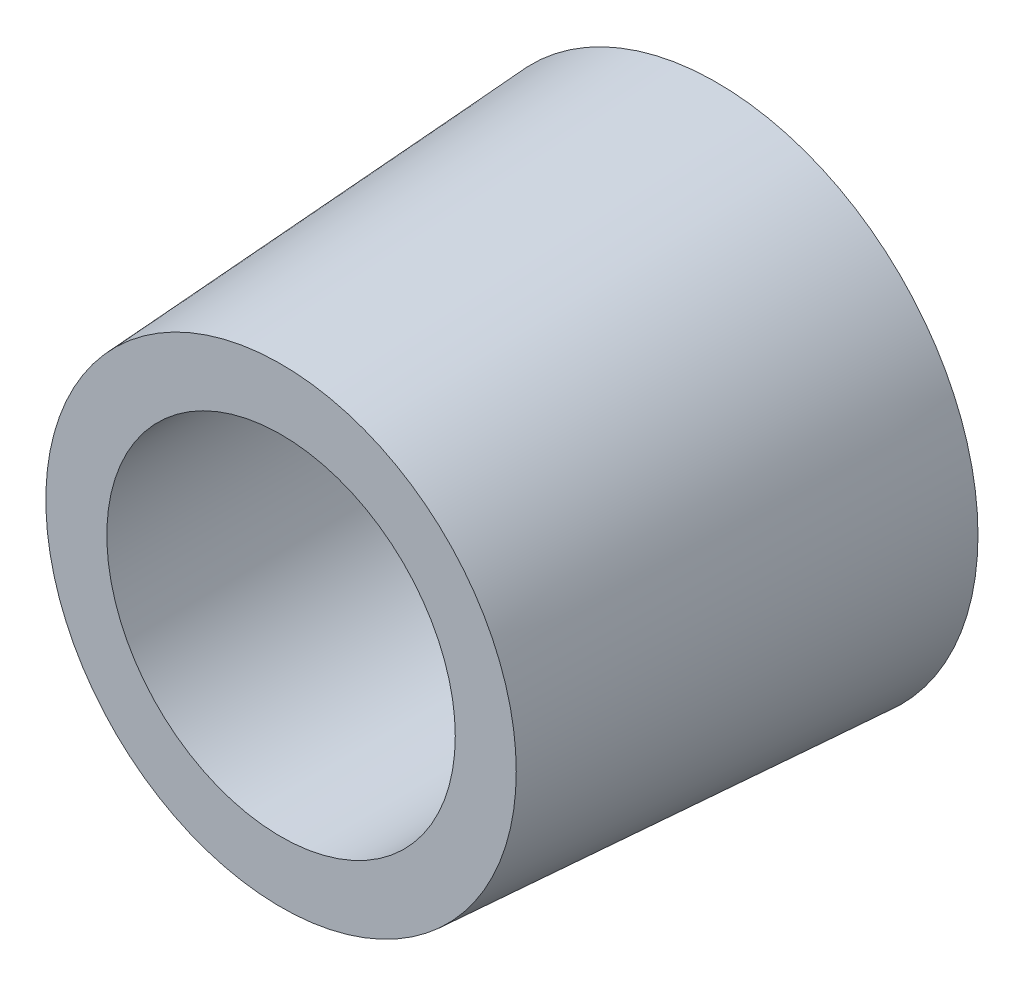
ISO-10303-21;
HEADER;
FILE_DESCRIPTION(('STEP AP214'),'2;1');
FILE_NAME('part.step','',(''),(''),'','','');
FILE_SCHEMA(('AUTOMOTIVE_DESIGN { 1 0 10303 214 1 1 1 1 }'));
ENDSEC;
DATA;
#1=APPLICATION_CONTEXT('core data for automotive mechanical design processes');
#2=APPLICATION_PROTOCOL_DEFINITION('international standard','automotive_design',2000,#1);
#3=PRODUCT_CONTEXT('',#1,'mechanical');
#4=PRODUCT('Part','Part','',(#3));
#5=PRODUCT_RELATED_PRODUCT_CATEGORY('part','',(#4));
#6=PRODUCT_DEFINITION_FORMATION('','',#4);
#7=PRODUCT_DEFINITION_CONTEXT('part definition',#1,'design');
#8=PRODUCT_DEFINITION('design','',#6,#7);
#9=PRODUCT_DEFINITION_SHAPE('','',#8);
#10=(LENGTH_UNIT() NAMED_UNIT(*) SI_UNIT(.MILLI.,.METRE.));
#11=(NAMED_UNIT(*) PLANE_ANGLE_UNIT() SI_UNIT($,.RADIAN.));
#12=(NAMED_UNIT(*) SI_UNIT($,.STERADIAN.) SOLID_ANGLE_UNIT());
#13=UNCERTAINTY_MEASURE_WITH_UNIT(LENGTH_MEASURE(1.E-05),#10,'distance_accuracy_value','');
#14=(GEOMETRIC_REPRESENTATION_CONTEXT(3) GLOBAL_UNCERTAINTY_ASSIGNED_CONTEXT((#13)) GLOBAL_UNIT_ASSIGNED_CONTEXT((#10,
#11,#12)) REPRESENTATION_CONTEXT('',''));
#15=CARTESIAN_POINT('',(0.,0.,0.));
#16=DIRECTION('',(0.,0.,1.));
#17=DIRECTION('',(1.,0.,0.));
#18=AXIS2_PLACEMENT_3D('',#15,#16,#17);
#19=CARTESIAN_POINT('',(0.,0.,5.));
#20=DIRECTION('',(0.,0.,1.));
#21=DIRECTION('',(1.,0.,0.));
#22=AXIS2_PLACEMENT_3D('',#19,#20,#21);
#23=PLANE('',#22);
#24=CARTESIAN_POINT('',(0.,0.,5.));
#25=DIRECTION('',(0.,0.,1.));
#26=DIRECTION('',(1.,0.,0.));
#27=AXIS2_PLACEMENT_3D('',#24,#25,#26);
#28=CIRCLE('',#27,2.);
#29=CARTESIAN_POINT('',(2.,0.,5.));
#30=VERTEX_POINT('',#29);
#31=EDGE_CURVE('E103',#30,#30,#28,.T.);
#32=ORIENTED_EDGE('',*,*,#31,.F.);
#33=EDGE_LOOP('',(#32));
#34=FACE_BOUND('',#33,.T.);
#35=CARTESIAN_POINT('',(0.,0.,5.));
#36=DIRECTION('',(0.,0.,1.));
#37=DIRECTION('',(1.,0.,0.));
#38=AXIS2_PLACEMENT_3D('',#35,#36,#37);
#39=CIRCLE('',#38,2.7);
#40=CARTESIAN_POINT('',(2.7,0.,5.));
#41=VERTEX_POINT('',#40);
#42=EDGE_CURVE('E11',#41,#41,#39,.T.);
#43=ORIENTED_EDGE('',*,*,#42,.T.);
#44=EDGE_LOOP('',(#43));
#45=FACE_BOUND('',#44,.T.);
#46=ADVANCED_FACE('F35',(#34,#45),#23,.T.);
#47=CARTESIAN_POINT('',(0.,0.,0.));
#48=DIRECTION('',(0.,0.,1.));
#49=DIRECTION('',(1.,0.,0.));
#50=AXIS2_PLACEMENT_3D('',#47,#48,#49);
#51=PLANE('',#50);
#52=CARTESIAN_POINT('',(0.,0.,0.));
#53=DIRECTION('',(0.,0.,1.));
#54=DIRECTION('',(1.,0.,0.));
#55=AXIS2_PLACEMENT_3D('',#52,#53,#54);
#56=CIRCLE('',#55,2.);
#57=CARTESIAN_POINT('',(2.,0.,0.));
#58=VERTEX_POINT('',#57);
#59=EDGE_CURVE('E39',#58,#58,#56,.T.);
#60=ORIENTED_EDGE('',*,*,#59,.T.);
#61=EDGE_LOOP('',(#60));
#62=FACE_BOUND('',#61,.T.);
#63=CARTESIAN_POINT('',(0.,0.,0.));
#64=DIRECTION('',(0.,0.,1.));
#65=DIRECTION('',(1.,0.,0.));
#66=AXIS2_PLACEMENT_3D('',#63,#64,#65);
#67=CIRCLE('',#66,3.);
#68=CARTESIAN_POINT('',(3.,0.,0.));
#69=VERTEX_POINT('',#68);
#70=EDGE_CURVE('E43',#69,#69,#67,.T.);
#71=ORIENTED_EDGE('',*,*,#70,.F.);
#72=EDGE_LOOP('',(#71));
#73=FACE_BOUND('',#72,.T.);
#74=ADVANCED_FACE('F68',(#62,#73),#51,.F.);
#75=CARTESIAN_POINT('',(0.,0.,5.));
#76=DIRECTION('',(0.,0.,-1.));
#77=DIRECTION('',(-1.,0.,0.));
#78=AXIS2_PLACEMENT_3D('',#75,#76,#77);
#79=CONICAL_SURFACE('',#78,2.7,0.059928155121208);
#80=ORIENTED_EDGE('',*,*,#70,.T.);
#81=EDGE_LOOP('',(#80));
#82=FACE_BOUND('',#81,.T.);
#83=ORIENTED_EDGE('',*,*,#42,.F.);
#84=EDGE_LOOP('',(#83));
#85=FACE_BOUND('',#84,.T.);
#86=ADVANCED_FACE('F77',(#82,#85),#79,.T.);
#87=CARTESIAN_POINT('',(0.,0.,-5.));
#88=DIRECTION('',(0.,0.,1.));
#89=DIRECTION('',(1.,0.,0.));
#90=AXIS2_PLACEMENT_3D('',#87,#88,#89);
#91=CYLINDRICAL_SURFACE('',#90,2.);
#92=ORIENTED_EDGE('',*,*,#31,.T.);
#93=EDGE_LOOP('',(#92));
#94=FACE_BOUND('',#93,.T.);
#95=ORIENTED_EDGE('',*,*,#59,.F.);
#96=EDGE_LOOP('',(#95));
#97=FACE_BOUND('',#96,.T.);
#98=ADVANCED_FACE('F79',(#94,#97),#91,.F.);
#99=CLOSED_SHELL('',(#46,#74,#86,#98));
#100=MANIFOLD_SOLID_BREP('B2',#99);
#101=ADVANCED_BREP_SHAPE_REPRESENTATION('',(#18,#100),#14);
#102=SHAPE_DEFINITION_REPRESENTATION(#9,#101);
ENDSEC;
END-ISO-10303-21;
